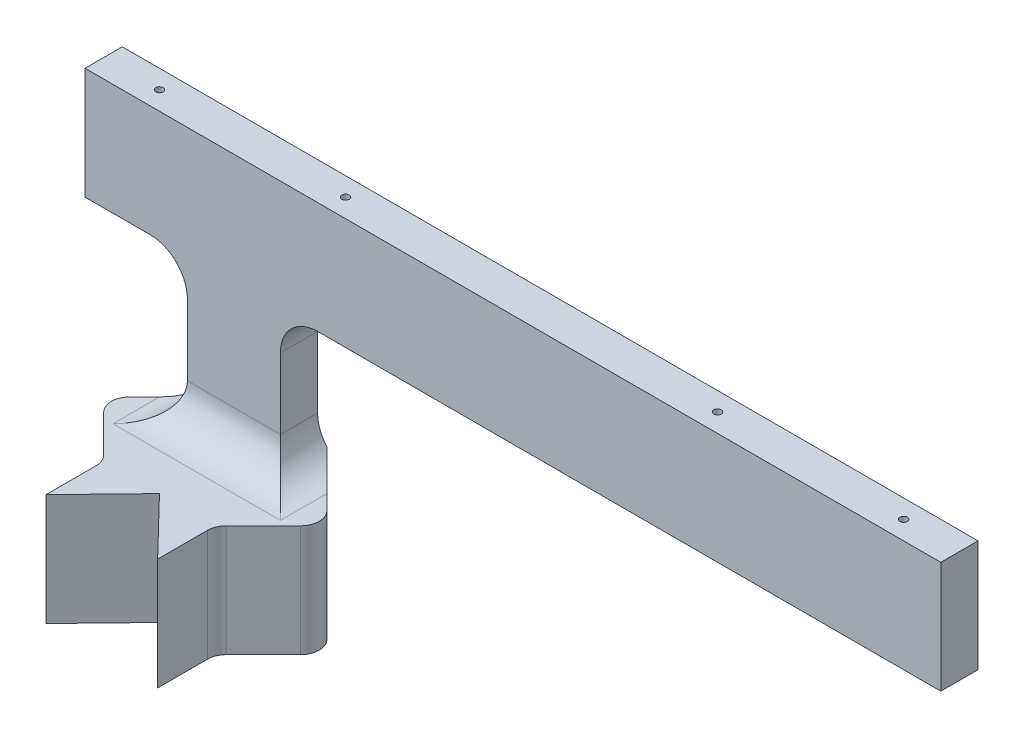
ISO-10303-21;
HEADER;
FILE_DESCRIPTION(('STEP AP214'),'2;1');
FILE_NAME('part.step','',(''),(''),'','','');
FILE_SCHEMA(('AUTOMOTIVE_DESIGN { 1 0 10303 214 1 1 1 1 }'));
ENDSEC;
DATA;
#1=APPLICATION_CONTEXT('core data for automotive mechanical design processes');
#2=APPLICATION_PROTOCOL_DEFINITION('international standard','automotive_design',2000,#1);
#3=PRODUCT_CONTEXT('',#1,'mechanical');
#4=PRODUCT('Part','Part','',(#3));
#5=PRODUCT_RELATED_PRODUCT_CATEGORY('part','',(#4));
#6=PRODUCT_DEFINITION_FORMATION('','',#4);
#7=PRODUCT_DEFINITION_CONTEXT('part definition',#1,'design');
#8=PRODUCT_DEFINITION('design','',#6,#7);
#9=PRODUCT_DEFINITION_SHAPE('','',#8);
#10=(LENGTH_UNIT() NAMED_UNIT(*) SI_UNIT(.MILLI.,.METRE.));
#11=(NAMED_UNIT(*) PLANE_ANGLE_UNIT() SI_UNIT($,.RADIAN.));
#12=(NAMED_UNIT(*) SI_UNIT($,.STERADIAN.) SOLID_ANGLE_UNIT());
#13=UNCERTAINTY_MEASURE_WITH_UNIT(LENGTH_MEASURE(1.E-05),#10,'distance_accuracy_value','');
#14=(GEOMETRIC_REPRESENTATION_CONTEXT(3) GLOBAL_UNCERTAINTY_ASSIGNED_CONTEXT((#13)) GLOBAL_UNIT_ASSIGNED_CONTEXT((#10,
#11,#12)) REPRESENTATION_CONTEXT('',''));
#15=CARTESIAN_POINT('',(0.,0.,0.));
#16=DIRECTION('',(0.,0.,1.));
#17=DIRECTION('',(1.,0.,0.));
#18=AXIS2_PLACEMENT_3D('',#15,#16,#17);
#19=CARTESIAN_POINT('',(0.,-54.,0.));
#20=DIRECTION('',(0.,1.,0.));
#21=DIRECTION('',(-1.,0.,0.));
#22=AXIS2_PLACEMENT_3D('',#19,#20,#21);
#23=PLANE('',#22);
#24=DIRECTION('',(-0.707106845079773,0.,-0.707106717293317));
#25=VECTOR('',#24,1.);
#26=CARTESIAN_POINT('',(-29.9999945784798,-54.,29.9999999999995));
#27=LINE('',#26,#25);
#28=CARTESIAN_POINT('',(-48.5355342253989,-54.,11.4644637027735));
#29=VERTEX_POINT('',#28);
#30=CARTESIAN_POINT('',(-52.5,-54.,7.49999864462005));
#31=VERTEX_POINT('',#30);
#32=EDGE_CURVE('E323',#29,#31,#27,.T.);
#33=ORIENTED_EDGE('',*,*,#32,.T.);
#34=DIRECTION('',(0.,0.,-1.));
#35=VECTOR('',#34,1.);
#36=CARTESIAN_POINT('',(-52.5,-54.,0.));
#37=LINE('',#36,#35);
#38=CARTESIAN_POINT('',(-52.5,-54.,20.));
#39=VERTEX_POINT('',#38);
#40=EDGE_CURVE('E462',#31,#39,#37,.F.);
#41=ORIENTED_EDGE('',*,*,#40,.T.);
#42=DIRECTION('',(1.,0.,0.));
#43=VECTOR('',#42,1.);
#44=CARTESIAN_POINT('',(0.,-54.,20.));
#45=LINE('',#44,#43);
#46=CARTESIAN_POINT('',(-97.5,-54.,20.));
#47=VERTEX_POINT('',#46);
#48=EDGE_CURVE('E458',#39,#47,#45,.F.);
#49=ORIENTED_EDGE('',*,*,#48,.T.);
#50=DIRECTION('',(0.,0.,1.));
#51=VECTOR('',#50,1.);
#52=CARTESIAN_POINT('',(-97.5,-54.,0.));
#53=LINE('',#52,#51);
#54=CARTESIAN_POINT('',(-97.5,-54.,7.49999864462007));
#55=VERTEX_POINT('',#54);
#56=EDGE_CURVE('E460',#47,#55,#53,.F.);
#57=ORIENTED_EDGE('',*,*,#56,.T.);
#58=DIRECTION('',(0.707106845079774,0.,-0.707106717293316));
#59=VECTOR('',#58,1.);
#60=CARTESIAN_POINT('',(-44.9999918677196,-54.,-44.9999999999993));
#61=LINE('',#60,#59);
#62=CARTESIAN_POINT('',(-101.464465774601,-54.,11.4644637027735));
#63=VERTEX_POINT('',#62);
#64=EDGE_CURVE('E312',#63,#55,#61,.T.);
#65=ORIENTED_EDGE('',*,*,#64,.F.);
#66=CARTESIAN_POINT('',(-97.9289321881345,-54.,14.9999979281723));
#67=DIRECTION('',(0.,1.,0.));
#68=DIRECTION('',(-1.,0.,0.));
#69=AXIS2_PLACEMENT_3D('',#66,#67,#68);
#70=CIRCLE('',#69,5.);
#71=CARTESIAN_POINT('',(-101.464466413533,-54.,18.535531514639));
#72=VERTEX_POINT('',#71);
#73=EDGE_CURVE('E436',#63,#72,#70,.T.);
#74=ORIENTED_EDGE('',*,*,#73,.T.);
#75=DIRECTION('',(-0.707106717293327,0.,-0.707106845079762));
#76=VECTOR('',#75,1.);
#77=CARTESIAN_POINT('',(-60.0000081322786,-54.,59.9999972892396));
#78=LINE('',#77,#76);
#79=CARTESIAN_POINT('',(-91.4644657746012,-54.,28.5355339607445));
#80=VERTEX_POINT('',#79);
#81=EDGE_CURVE('E329',#80,#72,#78,.T.);
#82=ORIENTED_EDGE('',*,*,#81,.F.);
#83=CARTESIAN_POINT('',(-95.,-54.,32.0710675472111));
#84=DIRECTION('',(0.,1.,0.));
#85=DIRECTION('',(-1.,0.,0.));
#86=AXIS2_PLACEMENT_3D('',#83,#84,#85);
#87=CIRCLE('',#86,5.);
#88=CARTESIAN_POINT('',(-90.,-54.,32.0710675472111));
#89=VERTEX_POINT('',#88);
#90=EDGE_CURVE('E450',#80,#89,#87,.F.);
#91=ORIENTED_EDGE('',*,*,#90,.T.);
#92=DIRECTION('',(0.,0.,-1.));
#93=VECTOR('',#92,1.);
#94=CARTESIAN_POINT('',(-90.,-54.,0.));
#95=LINE('',#94,#93);
#96=CARTESIAN_POINT('',(-90.,-54.,45.4999972892401));
#97=VERTEX_POINT('',#96);
#98=EDGE_CURVE('E297',#97,#89,#95,.T.);
#99=ORIENTED_EDGE('',*,*,#98,.F.);
#100=DIRECTION('',(0.695421490319644,0.,-0.71860208098892));
#101=VECTOR('',#100,1.);
#102=CARTESIAN_POINT('',(-23.7372314068771,-54.,-22.9715182821565));
#103=LINE('',#102,#101);
#104=CARTESIAN_POINT('',(-75.,-54.,30.));
#105=VERTEX_POINT('',#104);
#106=EDGE_CURVE('E295',#97,#105,#103,.T.);
#107=ORIENTED_EDGE('',*,*,#106,.T.);
#108=DIRECTION('',(0.695421490319644,0.,0.71860208098892));
#109=VECTOR('',#108,1.);
#110=CARTESIAN_POINT('',(-53.7211112133638,-54.,51.9881812340602));
#111=LINE('',#110,#109);
#112=CARTESIAN_POINT('',(-60.,-54.,45.4999972892401));
#113=VERTEX_POINT('',#112);
#114=EDGE_CURVE('E282',#105,#113,#111,.T.);
#115=ORIENTED_EDGE('',*,*,#114,.T.);
#116=DIRECTION('',(0.,0.,-1.));
#117=VECTOR('',#116,1.);
#118=CARTESIAN_POINT('',(-60.,-54.,0.));
#119=LINE('',#118,#117);
#120=CARTESIAN_POINT('',(-60.,-54.,32.0710675472111));
#121=VERTEX_POINT('',#120);
#122=EDGE_CURVE('E278',#113,#121,#119,.T.);
#123=ORIENTED_EDGE('',*,*,#122,.T.);
#124=CARTESIAN_POINT('',(-55.,-54.,32.0710675472111));
#125=DIRECTION('',(0.,1.,0.));
#126=DIRECTION('',(-1.,0.,0.));
#127=AXIS2_PLACEMENT_3D('',#124,#125,#126);
#128=CIRCLE('',#127,5.);
#129=CARTESIAN_POINT('',(-58.5355342253988,-54.,28.5355339607445));
#130=VERTEX_POINT('',#129);
#131=EDGE_CURVE('E453',#121,#130,#128,.F.);
#132=ORIENTED_EDGE('',*,*,#131,.T.);
#133=DIRECTION('',(0.707106717293327,0.,-0.707106845079763));
#134=VECTOR('',#133,1.);
#135=CARTESIAN_POINT('',(-15.0000054215195,-54.,-15.0000027107592));
#136=LINE('',#135,#134);
#137=CARTESIAN_POINT('',(-48.5355335864667,-54.,18.535531514639));
#138=VERTEX_POINT('',#137);
#139=EDGE_CURVE('E316',#130,#138,#136,.T.);
#140=ORIENTED_EDGE('',*,*,#139,.T.);
#141=CARTESIAN_POINT('',(-52.0710678118655,-54.,14.9999979281724));
#142=DIRECTION('',(0.,1.,0.));
#143=DIRECTION('',(-1.,0.,0.));
#144=AXIS2_PLACEMENT_3D('',#141,#142,#143);
#145=CIRCLE('',#144,5.);
#146=EDGE_CURVE('E434',#138,#29,#145,.T.);
#147=ORIENTED_EDGE('',*,*,#146,.T.);
#148=EDGE_LOOP('',(#33,#41,#49,#57,#65,#74,#82,#91,#99,#107,#115,#123,#132,#140,#147));
#149=FACE_BOUND('',#148,.T.);
#150=ADVANCED_FACE('F93',(#149),#23,.T.);
#151=CARTESIAN_POINT('',(0.,-84.,0.));
#152=DIRECTION('',(0.,1.,0.));
#153=DIRECTION('',(-1.,0.,0.));
#154=AXIS2_PLACEMENT_3D('',#151,#152,#153);
#155=PLANE('',#154);
#156=DIRECTION('',(0.707106717293327,0.,0.707106845079762));
#157=VECTOR('',#156,1.);
#158=CARTESIAN_POINT('',(-60.0000081322786,-84.,59.9999972892396));
#159=LINE('',#158,#157);
#160=CARTESIAN_POINT('',(-101.464466413533,-84.,18.535531514639));
#161=VERTEX_POINT('',#160);
#162=CARTESIAN_POINT('',(-91.4644657746012,-84.,28.5355339607445));
#163=VERTEX_POINT('',#162);
#164=EDGE_CURVE('E320',#161,#163,#159,.T.);
#165=ORIENTED_EDGE('',*,*,#164,.F.);
#166=CARTESIAN_POINT('',(-97.9289321881345,-84.,14.9999979281723));
#167=DIRECTION('',(0.,1.,0.));
#168=DIRECTION('',(-1.,0.,0.));
#169=AXIS2_PLACEMENT_3D('',#166,#167,#168);
#170=CIRCLE('',#169,5.);
#171=CARTESIAN_POINT('',(-101.464465774601,-84.,11.4644637027735));
#172=VERTEX_POINT('',#171);
#173=EDGE_CURVE('E430',#161,#172,#170,.F.);
#174=ORIENTED_EDGE('',*,*,#173,.T.);
#175=DIRECTION('',(-0.707106845079774,0.,0.707106717293316));
#176=VECTOR('',#175,1.);
#177=CARTESIAN_POINT('',(-44.9999918677196,-84.,-44.9999999999993));
#178=LINE('',#177,#176);
#179=CARTESIAN_POINT('',(-90.,-84.,0.));
#180=VERTEX_POINT('',#179);
#181=EDGE_CURVE('E308',#180,#172,#178,.T.);
#182=ORIENTED_EDGE('',*,*,#181,.F.);
#183=DIRECTION('',(1.,0.,0.));
#184=VECTOR('',#183,1.);
#185=CARTESIAN_POINT('',(-45.,-84.,0.));
#186=LINE('',#185,#184);
#187=CARTESIAN_POINT('',(-60.,-84.,0.));
#188=VERTEX_POINT('',#187);
#189=EDGE_CURVE('E332',#180,#188,#186,.T.);
#190=ORIENTED_EDGE('',*,*,#189,.T.);
#191=DIRECTION('',(0.707106845079773,0.,0.707106717293317));
#192=VECTOR('',#191,1.);
#193=CARTESIAN_POINT('',(-29.9999945784798,-84.,29.9999999999995));
#194=LINE('',#193,#192);
#195=CARTESIAN_POINT('',(-48.5355342253989,-84.,11.4644637027735));
#196=VERTEX_POINT('',#195);
#197=EDGE_CURVE('E319',#188,#196,#194,.T.);
#198=ORIENTED_EDGE('',*,*,#197,.T.);
#199=CARTESIAN_POINT('',(-52.0710678118655,-84.,14.9999979281724));
#200=DIRECTION('',(0.,1.,0.));
#201=DIRECTION('',(-1.,0.,0.));
#202=AXIS2_PLACEMENT_3D('',#199,#200,#201);
#203=CIRCLE('',#202,5.);
#204=CARTESIAN_POINT('',(-48.5355335864667,-84.,18.535531514639));
#205=VERTEX_POINT('',#204);
#206=EDGE_CURVE('E428',#196,#205,#203,.F.);
#207=ORIENTED_EDGE('',*,*,#206,.T.);
#208=DIRECTION('',(-0.707106717293327,0.,0.707106845079763));
#209=VECTOR('',#208,1.);
#210=CARTESIAN_POINT('',(-15.0000054215195,-84.,-15.0000027107592));
#211=LINE('',#210,#209);
#212=CARTESIAN_POINT('',(-58.5355342253988,-84.,28.5355339607445));
#213=VERTEX_POINT('',#212);
#214=EDGE_CURVE('E306',#205,#213,#211,.T.);
#215=ORIENTED_EDGE('',*,*,#214,.T.);
#216=CARTESIAN_POINT('',(-55.,-84.,32.0710675472111));
#217=DIRECTION('',(0.,1.,0.));
#218=DIRECTION('',(-1.,0.,0.));
#219=AXIS2_PLACEMENT_3D('',#216,#217,#218);
#220=CIRCLE('',#219,5.);
#221=CARTESIAN_POINT('',(-60.,-84.,32.0710675472111));
#222=VERTEX_POINT('',#221);
#223=EDGE_CURVE('E270',#213,#222,#220,.T.);
#224=ORIENTED_EDGE('',*,*,#223,.T.);
#225=DIRECTION('',(0.,0.,-1.));
#226=VECTOR('',#225,1.);
#227=CARTESIAN_POINT('',(-60.,-84.,0.));
#228=LINE('',#227,#226);
#229=CARTESIAN_POINT('',(-60.,-84.,45.4999972892401));
#230=VERTEX_POINT('',#229);
#231=EDGE_CURVE('E262',#230,#222,#228,.T.);
#232=ORIENTED_EDGE('',*,*,#231,.F.);
#233=DIRECTION('',(0.695421490319644,0.,0.71860208098892));
#234=VECTOR('',#233,1.);
#235=CARTESIAN_POINT('',(-53.7211112133638,-84.,51.9881812340602));
#236=LINE('',#235,#234);
#237=CARTESIAN_POINT('',(-75.,-84.,30.));
#238=VERTEX_POINT('',#237);
#239=EDGE_CURVE('E268',#238,#230,#236,.T.);
#240=ORIENTED_EDGE('',*,*,#239,.F.);
#241=DIRECTION('',(0.695421490319644,0.,-0.71860208098892));
#242=VECTOR('',#241,1.);
#243=CARTESIAN_POINT('',(-23.7372314068771,-84.,-22.9715182821565));
#244=LINE('',#243,#242);
#245=CARTESIAN_POINT('',(-90.,-84.,45.4999972892401));
#246=VERTEX_POINT('',#245);
#247=EDGE_CURVE('E293',#246,#238,#244,.T.);
#248=ORIENTED_EDGE('',*,*,#247,.F.);
#249=DIRECTION('',(0.,0.,-1.));
#250=VECTOR('',#249,1.);
#251=CARTESIAN_POINT('',(-90.,-84.,0.));
#252=LINE('',#251,#250);
#253=CARTESIAN_POINT('',(-90.,-84.,32.0710675472111));
#254=VERTEX_POINT('',#253);
#255=EDGE_CURVE('E298',#246,#254,#252,.T.);
#256=ORIENTED_EDGE('',*,*,#255,.T.);
#257=CARTESIAN_POINT('',(-95.,-84.,32.0710675472111));
#258=DIRECTION('',(0.,1.,0.));
#259=DIRECTION('',(-1.,0.,0.));
#260=AXIS2_PLACEMENT_3D('',#257,#258,#259);
#261=CIRCLE('',#260,5.);
#262=EDGE_CURVE('E448',#254,#163,#261,.T.);
#263=ORIENTED_EDGE('',*,*,#262,.T.);
#264=EDGE_LOOP('',(#165,#174,#182,#190,#198,#207,#215,#224,#232,#240,#248,#256,#263));
#265=FACE_BOUND('',#264,.T.);
#266=ADVANCED_FACE('F265',(#265),#155,.F.);
#267=CARTESIAN_POINT('',(0.,0.,0.));
#268=DIRECTION('',(0.,0.,-1.));
#269=DIRECTION('',(-1.,0.,0.));
#270=AXIS2_PLACEMENT_3D('',#267,#268,#269);
#271=PLANE('',#270);
#272=DIRECTION('',(0.,-1.,0.));
#273=VECTOR('',#272,1.);
#274=CARTESIAN_POINT('',(-90.,-44.,0.));
#275=LINE('',#274,#273);
#276=CARTESIAN_POINT('',(-90.,-50.6143782776615,0.));
#277=VERTEX_POINT('',#276);
#278=EDGE_CURVE('E109',#277,#180,#275,.T.);
#279=ORIENTED_EDGE('',*,*,#278,.F.);
#280=CARTESIAN_POINT('',(-97.5,-44.,0.));
#281=DIRECTION('',(0.,0.,-1.));
#282=DIRECTION('',(-1.,0.,0.));
#283=AXIS2_PLACEMENT_3D('',#280,#281,#282);
#284=CIRCLE('',#283,10.);
#285=CARTESIAN_POINT('',(-87.5,-44.,0.));
#286=VERTEX_POINT('',#285);
#287=EDGE_CURVE('E12',#277,#286,#284,.F.);
#288=ORIENTED_EDGE('',*,*,#287,.T.);
#289=DIRECTION('',(0.,1.,0.));
#290=VECTOR('',#289,1.);
#291=CARTESIAN_POINT('',(-87.5,-69.,0.));
#292=LINE('',#291,#290);
#293=CARTESIAN_POINT('',(-87.5,-25.,0.));
#294=VERTEX_POINT('',#293);
#295=EDGE_CURVE('E340',#286,#294,#292,.T.);
#296=ORIENTED_EDGE('',*,*,#295,.T.);
#297=CARTESIAN_POINT('',(-97.5,-25.,0.));
#298=DIRECTION('',(0.,0.,-1.));
#299=DIRECTION('',(-1.,0.,0.));
#300=AXIS2_PLACEMENT_3D('',#297,#298,#299);
#301=CIRCLE('',#300,10.);
#302=CARTESIAN_POINT('',(-97.5,-15.,0.));
#303=VERTEX_POINT('',#302);
#304=EDGE_CURVE('E415',#294,#303,#301,.F.);
#305=ORIENTED_EDGE('',*,*,#304,.T.);
#306=DIRECTION('',(1.,0.,0.));
#307=VECTOR('',#306,1.);
#308=CARTESIAN_POINT('',(115.,-15.,0.));
#309=LINE('',#308,#307);
#310=CARTESIAN_POINT('',(-115.,-15.,0.));
#311=VERTEX_POINT('',#310);
#312=EDGE_CURVE('E383',#311,#303,#309,.T.);
#313=ORIENTED_EDGE('',*,*,#312,.F.);
#314=DIRECTION('',(0.,-1.,0.));
#315=VECTOR('',#314,1.);
#316=CARTESIAN_POINT('',(-115.,15.,0.));
#317=LINE('',#316,#315);
#318=CARTESIAN_POINT('',(-115.,15.,0.));
#319=VERTEX_POINT('',#318);
#320=EDGE_CURVE('E366',#319,#311,#317,.T.);
#321=ORIENTED_EDGE('',*,*,#320,.F.);
#322=DIRECTION('',(-1.,0.,0.));
#323=VECTOR('',#322,1.);
#324=CARTESIAN_POINT('',(115.,15.,0.));
#325=LINE('',#324,#323);
#326=CARTESIAN_POINT('',(115.,15.,0.));
#327=VERTEX_POINT('',#326);
#328=EDGE_CURVE('E371',#327,#319,#325,.T.);
#329=ORIENTED_EDGE('',*,*,#328,.F.);
#330=DIRECTION('',(0.,1.,0.));
#331=VECTOR('',#330,1.);
#332=CARTESIAN_POINT('',(115.,15.,0.));
#333=LINE('',#332,#331);
#334=CARTESIAN_POINT('',(115.,-15.,0.));
#335=VERTEX_POINT('',#334);
#336=EDGE_CURVE('E386',#335,#327,#333,.T.);
#337=ORIENTED_EDGE('',*,*,#336,.F.);
#338=CARTESIAN_POINT('',(-52.5,-15.,0.));
#339=VERTEX_POINT('',#338);
#340=EDGE_CURVE('E382',#339,#335,#309,.T.);
#341=ORIENTED_EDGE('',*,*,#340,.F.);
#342=CARTESIAN_POINT('',(-52.5,-25.,0.));
#343=DIRECTION('',(0.,0.,-1.));
#344=DIRECTION('',(-1.,0.,0.));
#345=AXIS2_PLACEMENT_3D('',#342,#343,#344);
#346=CIRCLE('',#345,10.);
#347=CARTESIAN_POINT('',(-62.5,-25.,0.));
#348=VERTEX_POINT('',#347);
#349=EDGE_CURVE('E412',#339,#348,#346,.F.);
#350=ORIENTED_EDGE('',*,*,#349,.T.);
#351=DIRECTION('',(0.,1.,0.));
#352=VECTOR('',#351,1.);
#353=CARTESIAN_POINT('',(-62.5,-69.,0.));
#354=LINE('',#353,#352);
#355=CARTESIAN_POINT('',(-62.5,-44.,0.));
#356=VERTEX_POINT('',#355);
#357=EDGE_CURVE('E338',#356,#348,#354,.T.);
#358=ORIENTED_EDGE('',*,*,#357,.F.);
#359=CARTESIAN_POINT('',(-52.5,-44.,0.));
#360=DIRECTION('',(0.,0.,-1.));
#361=DIRECTION('',(-1.,0.,0.));
#362=AXIS2_PLACEMENT_3D('',#359,#360,#361);
#363=CIRCLE('',#362,10.);
#364=CARTESIAN_POINT('',(-60.,-50.6143782776615,0.));
#365=VERTEX_POINT('',#364);
#366=EDGE_CURVE('E468',#356,#365,#363,.F.);
#367=ORIENTED_EDGE('',*,*,#366,.T.);
#368=DIRECTION('',(0.,-1.,0.));
#369=VECTOR('',#368,1.);
#370=CARTESIAN_POINT('',(-60.,-44.,0.));
#371=LINE('',#370,#369);
#372=EDGE_CURVE('E117',#365,#188,#371,.T.);
#373=ORIENTED_EDGE('',*,*,#372,.T.);
#374=ORIENTED_EDGE('',*,*,#189,.F.);
#375=EDGE_LOOP('',(#279,#288,#296,#305,#313,#321,#329,#337,#341,#350,#358,#367,#373,#374));
#376=FACE_BOUND('',#375,.T.);
#377=ADVANCED_FACE('F530',(#376),#271,.T.);
#378=CARTESIAN_POINT('',(115.,-15.,10.));
#379=DIRECTION('',(0.,1.,0.));
#380=DIRECTION('',(-1.,0.,0.));
#381=AXIS2_PLACEMENT_3D('',#378,#379,#380);
#382=PLANE('',#381);
#383=CARTESIAN_POINT('',(-100.,-15.,5.));
#384=DIRECTION('',(0.,1.,0.));
#385=DIRECTION('',(-1.,0.,0.));
#386=AXIS2_PLACEMENT_3D('',#383,#384,#385);
#387=CIRCLE('',#386,0.999999999999998);
#388=CARTESIAN_POINT('',(-101.,-15.,5.));
#389=VERTEX_POINT('',#388);
#390=EDGE_CURVE('E360',#389,#389,#387,.T.);
#391=ORIENTED_EDGE('',*,*,#390,.T.);
#392=EDGE_LOOP('',(#391));
#393=FACE_BOUND('',#392,.T.);
#394=ORIENTED_EDGE('',*,*,#312,.T.);
#395=DIRECTION('',(0.,0.,-1.));
#396=VECTOR('',#395,1.);
#397=CARTESIAN_POINT('',(-97.5,-15.,10.));
#398=LINE('',#397,#396);
#399=CARTESIAN_POINT('',(-97.5,-15.,10.));
#400=VERTEX_POINT('',#399);
#401=EDGE_CURVE('E408',#303,#400,#398,.F.);
#402=ORIENTED_EDGE('',*,*,#401,.T.);
#403=DIRECTION('',(1.,0.,0.));
#404=VECTOR('',#403,1.);
#405=CARTESIAN_POINT('',(115.,-15.,10.));
#406=LINE('',#405,#404);
#407=CARTESIAN_POINT('',(-115.,-15.,10.));
#408=VERTEX_POINT('',#407);
#409=EDGE_CURVE('E372',#408,#400,#406,.T.);
#410=ORIENTED_EDGE('',*,*,#409,.F.);
#411=DIRECTION('',(0.,0.,-1.));
#412=VECTOR('',#411,1.);
#413=CARTESIAN_POINT('',(-115.,-15.,10.));
#414=LINE('',#413,#412);
#415=EDGE_CURVE('E397',#408,#311,#414,.T.);
#416=ORIENTED_EDGE('',*,*,#415,.T.);
#417=EDGE_LOOP('',(#394,#402,#410,#416));
#418=FACE_BOUND('',#417,.T.);
#419=ADVANCED_FACE('F568',(#393,#418),#382,.F.);
#420=CARTESIAN_POINT('',(50.,-15.,5.00000000000001));
#421=DIRECTION('',(0.,1.,0.));
#422=DIRECTION('',(-1.,0.,0.));
#423=AXIS2_PLACEMENT_3D('',#420,#421,#422);
#424=CIRCLE('',#423,0.999999999999998);
#425=CARTESIAN_POINT('',(49.,-15.,5.00000000000001));
#426=VERTEX_POINT('',#425);
#427=EDGE_CURVE('E354',#426,#426,#424,.T.);
#428=ORIENTED_EDGE('',*,*,#427,.T.);
#429=EDGE_LOOP('',(#428));
#430=FACE_BOUND('',#429,.T.);
#431=CARTESIAN_POINT('',(-50.,-15.,5.00000000000001));
#432=DIRECTION('',(0.,1.,0.));
#433=DIRECTION('',(-1.,0.,0.));
#434=AXIS2_PLACEMENT_3D('',#431,#432,#433);
#435=CIRCLE('',#434,0.999999999999998);
#436=CARTESIAN_POINT('',(-51.,-15.,5.00000000000001));
#437=VERTEX_POINT('',#436);
#438=EDGE_CURVE('E357',#437,#437,#435,.T.);
#439=ORIENTED_EDGE('',*,*,#438,.T.);
#440=EDGE_LOOP('',(#439));
#441=FACE_BOUND('',#440,.T.);
#442=CARTESIAN_POINT('',(100.,-15.,5.));
#443=DIRECTION('',(0.,1.,0.));
#444=DIRECTION('',(-1.,0.,0.));
#445=AXIS2_PLACEMENT_3D('',#442,#443,#444);
#446=CIRCLE('',#445,0.999999999999998);
#447=CARTESIAN_POINT('',(99.,-15.,5.));
#448=VERTEX_POINT('',#447);
#449=EDGE_CURVE('E363',#448,#448,#446,.T.);
#450=ORIENTED_EDGE('',*,*,#449,.T.);
#451=EDGE_LOOP('',(#450));
#452=FACE_BOUND('',#451,.T.);
#453=CARTESIAN_POINT('',(-52.5,-15.,10.));
#454=VERTEX_POINT('',#453);
#455=CARTESIAN_POINT('',(115.,-15.,10.));
#456=VERTEX_POINT('',#455);
#457=EDGE_CURVE('E370',#454,#456,#406,.T.);
#458=ORIENTED_EDGE('',*,*,#457,.F.);
#459=DIRECTION('',(0.,0.,1.));
#460=VECTOR('',#459,1.);
#461=CARTESIAN_POINT('',(-52.5,-15.,0.));
#462=LINE('',#461,#460);
#463=EDGE_CURVE('E403',#454,#339,#462,.F.);
#464=ORIENTED_EDGE('',*,*,#463,.T.);
#465=ORIENTED_EDGE('',*,*,#340,.T.);
#466=DIRECTION('',(0.,0.,-1.));
#467=VECTOR('',#466,1.);
#468=CARTESIAN_POINT('',(115.,-15.,10.));
#469=LINE('',#468,#467);
#470=EDGE_CURVE('E394',#456,#335,#469,.T.);
#471=ORIENTED_EDGE('',*,*,#470,.F.);
#472=EDGE_LOOP('',(#458,#464,#465,#471));
#473=FACE_BOUND('',#472,.T.);
#474=ADVANCED_FACE('F579',(#430,#441,#452,#473),#382,.F.);
#475=CARTESIAN_POINT('',(-115.,15.,10.));
#476=DIRECTION('',(1.,0.,0.));
#477=DIRECTION('',(0.,0.,-1.));
#478=AXIS2_PLACEMENT_3D('',#475,#476,#477);
#479=PLANE('',#478);
#480=ORIENTED_EDGE('',*,*,#320,.T.);
#481=ORIENTED_EDGE('',*,*,#415,.F.);
#482=DIRECTION('',(0.,-1.,0.));
#483=VECTOR('',#482,1.);
#484=CARTESIAN_POINT('',(-115.,15.,10.));
#485=LINE('',#484,#483);
#486=CARTESIAN_POINT('',(-115.,15.,10.));
#487=VERTEX_POINT('',#486);
#488=EDGE_CURVE('E367',#487,#408,#485,.T.);
#489=ORIENTED_EDGE('',*,*,#488,.F.);
#490=DIRECTION('',(0.,0.,-1.));
#491=VECTOR('',#490,1.);
#492=CARTESIAN_POINT('',(-115.,15.,10.));
#493=LINE('',#492,#491);
#494=EDGE_CURVE('E379',#487,#319,#493,.T.);
#495=ORIENTED_EDGE('',*,*,#494,.T.);
#496=EDGE_LOOP('',(#480,#481,#489,#495));
#497=FACE_BOUND('',#496,.T.);
#498=ADVANCED_FACE('F575',(#497),#479,.F.);
#499=CARTESIAN_POINT('',(115.,15.,10.));
#500=DIRECTION('',(-1.,0.,0.));
#501=DIRECTION('',(0.,0.,1.));
#502=AXIS2_PLACEMENT_3D('',#499,#500,#501);
#503=PLANE('',#502);
#504=ORIENTED_EDGE('',*,*,#336,.T.);
#505=DIRECTION('',(0.,0.,-1.));
#506=VECTOR('',#505,1.);
#507=CARTESIAN_POINT('',(115.,15.,10.));
#508=LINE('',#507,#506);
#509=CARTESIAN_POINT('',(115.,15.,10.));
#510=VERTEX_POINT('',#509);
#511=EDGE_CURVE('E391',#510,#327,#508,.T.);
#512=ORIENTED_EDGE('',*,*,#511,.F.);
#513=DIRECTION('',(0.,1.,0.));
#514=VECTOR('',#513,1.);
#515=CARTESIAN_POINT('',(115.,15.,10.));
#516=LINE('',#515,#514);
#517=EDGE_CURVE('E375',#456,#510,#516,.T.);
#518=ORIENTED_EDGE('',*,*,#517,.F.);
#519=ORIENTED_EDGE('',*,*,#470,.T.);
#520=EDGE_LOOP('',(#504,#512,#518,#519));
#521=FACE_BOUND('',#520,.T.);
#522=ADVANCED_FACE('F571',(#521),#503,.F.);
#523=CARTESIAN_POINT('',(115.,15.,10.));
#524=DIRECTION('',(0.,-1.,0.));
#525=DIRECTION('',(1.,0.,0.));
#526=AXIS2_PLACEMENT_3D('',#523,#524,#525);
#527=PLANE('',#526);
#528=CARTESIAN_POINT('',(100.,15.,5.));
#529=DIRECTION('',(0.,1.,0.));
#530=DIRECTION('',(-1.,0.,0.));
#531=AXIS2_PLACEMENT_3D('',#528,#529,#530);
#532=CIRCLE('',#531,0.999999999999998);
#533=CARTESIAN_POINT('',(99.,15.,5.));
#534=VERTEX_POINT('',#533);
#535=EDGE_CURVE('E346',#534,#534,#532,.T.);
#536=ORIENTED_EDGE('',*,*,#535,.F.);
#537=EDGE_LOOP('',(#536));
#538=FACE_BOUND('',#537,.T.);
#539=CARTESIAN_POINT('',(-100.,15.,5.));
#540=DIRECTION('',(0.,1.,0.));
#541=DIRECTION('',(1.,0.,0.));
#542=AXIS2_PLACEMENT_3D('',#539,#540,#541);
#543=CIRCLE('',#542,0.999999999999998);
#544=CARTESIAN_POINT('',(-99.,15.,5.));
#545=VERTEX_POINT('',#544);
#546=EDGE_CURVE('E345',#545,#545,#543,.T.);
#547=ORIENTED_EDGE('',*,*,#546,.F.);
#548=EDGE_LOOP('',(#547));
#549=FACE_BOUND('',#548,.T.);
#550=CARTESIAN_POINT('',(-50.,15.,5.00000000000001));
#551=DIRECTION('',(0.,1.,0.));
#552=DIRECTION('',(1.,0.,0.));
#553=AXIS2_PLACEMENT_3D('',#550,#551,#552);
#554=CIRCLE('',#553,0.999999999999998);
#555=CARTESIAN_POINT('',(-49.,15.,5.00000000000001));
#556=VERTEX_POINT('',#555);
#557=EDGE_CURVE('E342',#556,#556,#554,.T.);
#558=ORIENTED_EDGE('',*,*,#557,.F.);
#559=EDGE_LOOP('',(#558));
#560=FACE_BOUND('',#559,.T.);
#561=CARTESIAN_POINT('',(50.,15.,5.00000000000001));
#562=DIRECTION('',(0.,1.,0.));
#563=DIRECTION('',(-1.,0.,0.));
#564=AXIS2_PLACEMENT_3D('',#561,#562,#563);
#565=CIRCLE('',#564,0.999999999999998);
#566=CARTESIAN_POINT('',(49.,15.,5.00000000000001));
#567=VERTEX_POINT('',#566);
#568=EDGE_CURVE('E349',#567,#567,#565,.T.);
#569=ORIENTED_EDGE('',*,*,#568,.F.);
#570=EDGE_LOOP('',(#569));
#571=FACE_BOUND('',#570,.T.);
#572=ORIENTED_EDGE('',*,*,#328,.T.);
#573=ORIENTED_EDGE('',*,*,#494,.F.);
#574=DIRECTION('',(-1.,0.,0.));
#575=VECTOR('',#574,1.);
#576=CARTESIAN_POINT('',(115.,15.,10.));
#577=LINE('',#576,#575);
#578=EDGE_CURVE('E377',#510,#487,#577,.T.);
#579=ORIENTED_EDGE('',*,*,#578,.F.);
#580=ORIENTED_EDGE('',*,*,#511,.T.);
#581=EDGE_LOOP('',(#572,#573,#579,#580));
#582=FACE_BOUND('',#581,.T.);
#583=ADVANCED_FACE('F564',(#538,#549,#560,#571,#582),#527,.F.);
#584=CARTESIAN_POINT('',(0.,0.,10.));
#585=DIRECTION('',(0.,0.,-1.));
#586=DIRECTION('',(-1.,0.,0.));
#587=AXIS2_PLACEMENT_3D('',#584,#585,#586);
#588=PLANE('',#587);
#589=DIRECTION('',(0.,1.,0.));
#590=VECTOR('',#589,1.);
#591=CARTESIAN_POINT('',(-87.5,-69.,10.));
#592=LINE('',#591,#590);
#593=CARTESIAN_POINT('',(-87.5,-44.,10.));
#594=VERTEX_POINT('',#593);
#595=CARTESIAN_POINT('',(-87.5,-25.,10.));
#596=VERTEX_POINT('',#595);
#597=EDGE_CURVE('E334',#594,#596,#592,.T.);
#598=ORIENTED_EDGE('',*,*,#597,.F.);
#599=DIRECTION('',(1.,0.,0.));
#600=VECTOR('',#599,1.);
#601=CARTESIAN_POINT('',(0.,-44.,10.));
#602=LINE('',#601,#600);
#603=CARTESIAN_POINT('',(-62.5,-44.,10.));
#604=VERTEX_POINT('',#603);
#605=EDGE_CURVE('E466',#594,#604,#602,.T.);
#606=ORIENTED_EDGE('',*,*,#605,.T.);
#607=DIRECTION('',(0.,1.,0.));
#608=VECTOR('',#607,1.);
#609=CARTESIAN_POINT('',(-62.5,-69.,10.));
#610=LINE('',#609,#608);
#611=CARTESIAN_POINT('',(-62.5,-25.,10.));
#612=VERTEX_POINT('',#611);
#613=EDGE_CURVE('E336',#604,#612,#610,.T.);
#614=ORIENTED_EDGE('',*,*,#613,.T.);
#615=CARTESIAN_POINT('',(-52.5,-25.,10.));
#616=DIRECTION('',(0.,0.,-1.));
#617=DIRECTION('',(-1.,0.,0.));
#618=AXIS2_PLACEMENT_3D('',#615,#616,#617);
#619=CIRCLE('',#618,10.);
#620=EDGE_CURVE('E410',#612,#454,#619,.T.);
#621=ORIENTED_EDGE('',*,*,#620,.T.);
#622=ORIENTED_EDGE('',*,*,#457,.T.);
#623=ORIENTED_EDGE('',*,*,#517,.T.);
#624=ORIENTED_EDGE('',*,*,#578,.T.);
#625=ORIENTED_EDGE('',*,*,#488,.T.);
#626=ORIENTED_EDGE('',*,*,#409,.T.);
#627=CARTESIAN_POINT('',(-97.5,-25.,10.));
#628=DIRECTION('',(0.,0.,-1.));
#629=DIRECTION('',(-1.,0.,0.));
#630=AXIS2_PLACEMENT_3D('',#627,#628,#629);
#631=CIRCLE('',#630,10.);
#632=EDGE_CURVE('E417',#400,#596,#631,.T.);
#633=ORIENTED_EDGE('',*,*,#632,.T.);
#634=EDGE_LOOP('',(#598,#606,#614,#621,#622,#623,#624,#625,#626,#633));
#635=FACE_BOUND('',#634,.T.);
#636=ADVANCED_FACE('F560',(#635),#588,.F.);
#637=CARTESIAN_POINT('',(50.,-39.,5.00000000000001));
#638=DIRECTION('',(0.,1.,0.));
#639=DIRECTION('',(-1.,0.,0.));
#640=AXIS2_PLACEMENT_3D('',#637,#638,#639);
#641=CYLINDRICAL_SURFACE('',#640,0.999999999999998);
#642=ORIENTED_EDGE('',*,*,#568,.T.);
#643=EDGE_LOOP('',(#642));
#644=FACE_BOUND('',#643,.T.);
#645=ORIENTED_EDGE('',*,*,#427,.F.);
#646=EDGE_LOOP('',(#645));
#647=FACE_BOUND('',#646,.T.);
#648=ADVANCED_FACE('F550',(#644,#647),#641,.F.);
#649=CARTESIAN_POINT('',(-50.,-39.,5.00000000000001));
#650=DIRECTION('',(0.,1.,0.));
#651=DIRECTION('',(-1.,0.,0.));
#652=AXIS2_PLACEMENT_3D('',#649,#650,#651);
#653=CYLINDRICAL_SURFACE('',#652,0.999999999999998);
#654=ORIENTED_EDGE('',*,*,#557,.T.);
#655=EDGE_LOOP('',(#654));
#656=FACE_BOUND('',#655,.T.);
#657=ORIENTED_EDGE('',*,*,#438,.F.);
#658=EDGE_LOOP('',(#657));
#659=FACE_BOUND('',#658,.T.);
#660=ADVANCED_FACE('F546',(#656,#659),#653,.F.);
#661=CARTESIAN_POINT('',(-100.,-39.,5.));
#662=DIRECTION('',(0.,1.,0.));
#663=DIRECTION('',(-1.,0.,0.));
#664=AXIS2_PLACEMENT_3D('',#661,#662,#663);
#665=CYLINDRICAL_SURFACE('',#664,0.999999999999998);
#666=ORIENTED_EDGE('',*,*,#546,.T.);
#667=EDGE_LOOP('',(#666));
#668=FACE_BOUND('',#667,.T.);
#669=ORIENTED_EDGE('',*,*,#390,.F.);
#670=EDGE_LOOP('',(#669));
#671=FACE_BOUND('',#670,.T.);
#672=ADVANCED_FACE('F549',(#668,#671),#665,.F.);
#673=CARTESIAN_POINT('',(100.,-39.,5.));
#674=DIRECTION('',(0.,1.,0.));
#675=DIRECTION('',(-1.,0.,0.));
#676=AXIS2_PLACEMENT_3D('',#673,#674,#675);
#677=CYLINDRICAL_SURFACE('',#676,0.999999999999998);
#678=ORIENTED_EDGE('',*,*,#535,.T.);
#679=EDGE_LOOP('',(#678));
#680=FACE_BOUND('',#679,.T.);
#681=ORIENTED_EDGE('',*,*,#449,.F.);
#682=EDGE_LOOP('',(#681));
#683=FACE_BOUND('',#682,.T.);
#684=ADVANCED_FACE('F544',(#680,#683),#677,.F.);
#685=CARTESIAN_POINT('',(-87.5,-69.,10.));
#686=DIRECTION('',(1.,0.,0.));
#687=DIRECTION('',(0.,1.,0.));
#688=AXIS2_PLACEMENT_3D('',#685,#686,#687);
#689=PLANE('',#688);
#690=ORIENTED_EDGE('',*,*,#295,.F.);
#691=DIRECTION('',(0.,0.,1.));
#692=VECTOR('',#691,1.);
#693=CARTESIAN_POINT('',(-87.5,-44.,10.));
#694=LINE('',#693,#692);
#695=EDGE_CURVE('E464',#286,#594,#694,.T.);
#696=ORIENTED_EDGE('',*,*,#695,.T.);
#697=ORIENTED_EDGE('',*,*,#597,.T.);
#698=DIRECTION('',(0.,0.,-1.));
#699=VECTOR('',#698,1.);
#700=CARTESIAN_POINT('',(-87.5,-25.,0.));
#701=LINE('',#700,#699);
#702=EDGE_CURVE('E405',#596,#294,#701,.T.);
#703=ORIENTED_EDGE('',*,*,#702,.T.);
#704=EDGE_LOOP('',(#690,#696,#697,#703));
#705=FACE_BOUND('',#704,.T.);
#706=ADVANCED_FACE('F540',(#705),#689,.F.);
#707=CARTESIAN_POINT('',(-62.5,-69.,10.));
#708=DIRECTION('',(-1.,0.,0.));
#709=DIRECTION('',(0.,-1.,0.));
#710=AXIS2_PLACEMENT_3D('',#707,#708,#709);
#711=PLANE('',#710);
#712=ORIENTED_EDGE('',*,*,#613,.F.);
#713=DIRECTION('',(0.,0.,-1.));
#714=VECTOR('',#713,1.);
#715=CARTESIAN_POINT('',(-62.5,-44.,10.));
#716=LINE('',#715,#714);
#717=EDGE_CURVE('E455',#604,#356,#716,.T.);
#718=ORIENTED_EDGE('',*,*,#717,.T.);
#719=ORIENTED_EDGE('',*,*,#357,.T.);
#720=DIRECTION('',(0.,0.,1.));
#721=VECTOR('',#720,1.);
#722=CARTESIAN_POINT('',(-62.5,-25.,10.));
#723=LINE('',#722,#721);
#724=EDGE_CURVE('E400',#348,#612,#723,.T.);
#725=ORIENTED_EDGE('',*,*,#724,.T.);
#726=EDGE_LOOP('',(#712,#718,#719,#725));
#727=FACE_BOUND('',#726,.T.);
#728=ADVANCED_FACE('F536',(#727),#711,.F.);
#729=CARTESIAN_POINT('',(-52.5,-25.,10.));
#730=DIRECTION('',(0.,0.,-1.));
#731=DIRECTION('',(-1.,0.,0.));
#732=AXIS2_PLACEMENT_3D('',#729,#730,#731);
#733=CYLINDRICAL_SURFACE('',#732,10.);
#734=ORIENTED_EDGE('',*,*,#349,.F.);
#735=ORIENTED_EDGE('',*,*,#463,.F.);
#736=ORIENTED_EDGE('',*,*,#620,.F.);
#737=ORIENTED_EDGE('',*,*,#724,.F.);
#738=EDGE_LOOP('',(#734,#735,#736,#737));
#739=FACE_BOUND('',#738,.T.);
#740=ADVANCED_FACE('F539',(#739),#733,.F.);
#741=CARTESIAN_POINT('',(-97.5,-25.,10.));
#742=DIRECTION('',(0.,0.,1.));
#743=DIRECTION('',(1.,0.,0.));
#744=AXIS2_PLACEMENT_3D('',#741,#742,#743);
#745=CYLINDRICAL_SURFACE('',#744,10.);
#746=ORIENTED_EDGE('',*,*,#632,.F.);
#747=ORIENTED_EDGE('',*,*,#401,.F.);
#748=ORIENTED_EDGE('',*,*,#304,.F.);
#749=ORIENTED_EDGE('',*,*,#702,.F.);
#750=EDGE_LOOP('',(#746,#747,#748,#749));
#751=FACE_BOUND('',#750,.T.);
#752=ADVANCED_FACE('F586',(#751),#745,.F.);
#753=CARTESIAN_POINT('',(-29.9999945784798,-44.,29.9999999999995));
#754=DIRECTION('',(0.707106717293317,0.,-0.707106845079773));
#755=DIRECTION('',(-0.707106845079773,0.,-0.707106717293317));
#756=AXIS2_PLACEMENT_3D('',#753,#754,#755);
#757=PLANE('',#756);
#758=ORIENTED_EDGE('',*,*,#32,.F.);
#759=DIRECTION('',(0.,-1.,0.));
#760=VECTOR('',#759,1.);
#761=CARTESIAN_POINT('',(-48.5355342253989,-44.,11.4644637027735));
#762=LINE('',#761,#760);
#763=EDGE_CURVE('E438',#29,#196,#762,.T.);
#764=ORIENTED_EDGE('',*,*,#763,.T.);
#765=ORIENTED_EDGE('',*,*,#197,.F.);
#766=ORIENTED_EDGE('',*,*,#372,.F.);
#767=CARTESIAN_POINT('',(-52.5,-44.,7.49999864462006));
#768=DIRECTION('',(0.707106717293317,0.,-0.707106845079773));
#769=DIRECTION('',(-0.707106845079773,0.,-0.707106717293317));
#770=AXIS2_PLACEMENT_3D('',#767,#768,#769);
#771=ELLIPSE('',#770,14.1421343458666,10.);
#772=EDGE_CURVE('E470',#365,#31,#771,.F.);
#773=ORIENTED_EDGE('',*,*,#772,.T.);
#774=EDGE_LOOP('',(#758,#764,#765,#766,#773));
#775=FACE_BOUND('',#774,.T.);
#776=ADVANCED_FACE('F533',(#775),#757,.T.);
#777=CARTESIAN_POINT('',(-60.0000081322786,-44.,59.9999972892396));
#778=DIRECTION('',(0.707106845079762,0.,-0.707106717293327));
#779=DIRECTION('',(-0.707106717293327,0.,-0.707106845079762));
#780=AXIS2_PLACEMENT_3D('',#777,#778,#779);
#781=PLANE('',#780);
#782=ORIENTED_EDGE('',*,*,#164,.T.);
#783=DIRECTION('',(0.,-1.,0.));
#784=VECTOR('',#783,1.);
#785=CARTESIAN_POINT('',(-91.4644657746012,-44.,28.5355339607445));
#786=LINE('',#785,#784);
#787=EDGE_CURVE('E426',#163,#80,#786,.F.);
#788=ORIENTED_EDGE('',*,*,#787,.T.);
#789=ORIENTED_EDGE('',*,*,#81,.T.);
#790=DIRECTION('',(0.,-1.,0.));
#791=VECTOR('',#790,1.);
#792=CARTESIAN_POINT('',(-101.464466413533,-44.,18.535531514639));
#793=LINE('',#792,#791);
#794=EDGE_CURVE('E423',#72,#161,#793,.T.);
#795=ORIENTED_EDGE('',*,*,#794,.T.);
#796=EDGE_LOOP('',(#782,#788,#789,#795));
#797=FACE_BOUND('',#796,.T.);
#798=ADVANCED_FACE('F501',(#797),#781,.F.);
#799=CARTESIAN_POINT('',(-44.9999918677196,-44.,-44.9999999999993));
#800=DIRECTION('',(0.707106717293316,0.,0.707106845079774));
#801=DIRECTION('',(0.707106845079774,0.,-0.707106717293316));
#802=AXIS2_PLACEMENT_3D('',#799,#800,#801);
#803=PLANE('',#802);
#804=ORIENTED_EDGE('',*,*,#181,.T.);
#805=DIRECTION('',(0.,-1.,0.));
#806=VECTOR('',#805,1.);
#807=CARTESIAN_POINT('',(-101.464465774601,-44.,11.4644637027735));
#808=LINE('',#807,#806);
#809=EDGE_CURVE('E432',#172,#63,#808,.F.);
#810=ORIENTED_EDGE('',*,*,#809,.T.);
#811=ORIENTED_EDGE('',*,*,#64,.T.);
#812=CARTESIAN_POINT('',(-97.5,-44.,7.49999864462006));
#813=DIRECTION('',(0.707106717293316,0.,0.707106845079774));
#814=DIRECTION('',(-0.707106845079774,0.,0.707106717293316));
#815=AXIS2_PLACEMENT_3D('',#812,#813,#814);
#816=ELLIPSE('',#815,14.1421343458665,10.);
#817=EDGE_CURVE('E102',#55,#277,#816,.T.);
#818=ORIENTED_EDGE('',*,*,#817,.T.);
#819=ORIENTED_EDGE('',*,*,#278,.T.);
#820=EDGE_LOOP('',(#804,#810,#811,#818,#819));
#821=FACE_BOUND('',#820,.T.);
#822=ADVANCED_FACE('F492',(#821),#803,.F.);
#823=CARTESIAN_POINT('',(-15.0000054215195,-44.,-15.0000027107592));
#824=DIRECTION('',(0.707106845079763,0.,0.707106717293327));
#825=DIRECTION('',(0.707106717293327,0.,-0.707106845079763));
#826=AXIS2_PLACEMENT_3D('',#823,#824,#825);
#827=PLANE('',#826);
#828=ORIENTED_EDGE('',*,*,#214,.F.);
#829=DIRECTION('',(0.,-1.,0.));
#830=VECTOR('',#829,1.);
#831=CARTESIAN_POINT('',(-48.5355335864667,-44.,18.535531514639));
#832=LINE('',#831,#830);
#833=EDGE_CURVE('E444',#205,#138,#832,.F.);
#834=ORIENTED_EDGE('',*,*,#833,.T.);
#835=ORIENTED_EDGE('',*,*,#139,.F.);
#836=DIRECTION('',(0.,-1.,0.));
#837=VECTOR('',#836,1.);
#838=CARTESIAN_POINT('',(-58.5355342253988,-44.,28.5355339607445));
#839=LINE('',#838,#837);
#840=EDGE_CURVE('E441',#130,#213,#839,.T.);
#841=ORIENTED_EDGE('',*,*,#840,.T.);
#842=EDGE_LOOP('',(#828,#834,#835,#841));
#843=FACE_BOUND('',#842,.T.);
#844=ADVANCED_FACE('F515',(#843),#827,.T.);
#845=CARTESIAN_POINT('',(-23.7372314068771,-54.,-22.9715182821565));
#846=DIRECTION('',(-0.71860208098892,0.,-0.695421490319643));
#847=DIRECTION('',(-0.695421490319644,0.,0.71860208098892));
#848=AXIS2_PLACEMENT_3D('',#845,#846,#847);
#849=PLANE('',#848);
#850=ORIENTED_EDGE('',*,*,#247,.T.);
#851=DIRECTION('',(0.,-1.,0.));
#852=VECTOR('',#851,1.);
#853=CARTESIAN_POINT('',(-75.,-54.,30.));
#854=LINE('',#853,#852);
#855=EDGE_CURVE('E287',#105,#238,#854,.T.);
#856=ORIENTED_EDGE('',*,*,#855,.F.);
#857=ORIENTED_EDGE('',*,*,#106,.F.);
#858=DIRECTION('',(0.,-1.,0.));
#859=VECTOR('',#858,1.);
#860=CARTESIAN_POINT('',(-90.,-54.,45.4999972892401));
#861=LINE('',#860,#859);
#862=EDGE_CURVE('E301',#97,#246,#861,.T.);
#863=ORIENTED_EDGE('',*,*,#862,.T.);
#864=EDGE_LOOP('',(#850,#856,#857,#863));
#865=FACE_BOUND('',#864,.T.);
#866=ADVANCED_FACE('F513',(#865),#849,.F.);
#867=CARTESIAN_POINT('',(-90.,-54.,0.));
#868=DIRECTION('',(-1.,0.,0.));
#869=DIRECTION('',(0.,-1.,0.));
#870=AXIS2_PLACEMENT_3D('',#867,#868,#869);
#871=PLANE('',#870);
#872=ORIENTED_EDGE('',*,*,#98,.T.);
#873=DIRECTION('',(0.,-1.,0.));
#874=VECTOR('',#873,1.);
#875=CARTESIAN_POINT('',(-90.,-54.,32.0710675472111));
#876=LINE('',#875,#874);
#877=EDGE_CURVE('E420',#89,#254,#876,.T.);
#878=ORIENTED_EDGE('',*,*,#877,.T.);
#879=ORIENTED_EDGE('',*,*,#255,.F.);
#880=ORIENTED_EDGE('',*,*,#862,.F.);
#881=EDGE_LOOP('',(#872,#878,#879,#880));
#882=FACE_BOUND('',#881,.T.);
#883=ADVANCED_FACE('F509',(#882),#871,.T.);
#884=CARTESIAN_POINT('',(-53.7211112133638,-54.,51.9881812340602));
#885=DIRECTION('',(0.71860208098892,0.,-0.695421490319644));
#886=DIRECTION('',(-0.695421490319644,0.,-0.71860208098892));
#887=AXIS2_PLACEMENT_3D('',#884,#885,#886);
#888=PLANE('',#887);
#889=ORIENTED_EDGE('',*,*,#239,.T.);
#890=DIRECTION('',(0.,-1.,0.));
#891=VECTOR('',#890,1.);
#892=CARTESIAN_POINT('',(-60.,-54.,45.4999972892401));
#893=LINE('',#892,#891);
#894=EDGE_CURVE('E273',#113,#230,#893,.T.);
#895=ORIENTED_EDGE('',*,*,#894,.F.);
#896=ORIENTED_EDGE('',*,*,#114,.F.);
#897=ORIENTED_EDGE('',*,*,#855,.T.);
#898=EDGE_LOOP('',(#889,#895,#896,#897));
#899=FACE_BOUND('',#898,.T.);
#900=ADVANCED_FACE('F285',(#899),#888,.F.);
#901=CARTESIAN_POINT('',(-60.,-54.,0.));
#902=DIRECTION('',(-1.,0.,0.));
#903=DIRECTION('',(0.,-1.,0.));
#904=AXIS2_PLACEMENT_3D('',#901,#902,#903);
#905=PLANE('',#904);
#906=ORIENTED_EDGE('',*,*,#231,.T.);
#907=DIRECTION('',(0.,-1.,0.));
#908=VECTOR('',#907,1.);
#909=CARTESIAN_POINT('',(-60.,-54.,32.0710675472111));
#910=LINE('',#909,#908);
#911=EDGE_CURVE('E446',#222,#121,#910,.F.);
#912=ORIENTED_EDGE('',*,*,#911,.T.);
#913=ORIENTED_EDGE('',*,*,#122,.F.);
#914=ORIENTED_EDGE('',*,*,#894,.T.);
#915=EDGE_LOOP('',(#906,#912,#913,#914));
#916=FACE_BOUND('',#915,.T.);
#917=ADVANCED_FACE('F276',(#916),#905,.F.);
#918=CARTESIAN_POINT('',(-95.,-54.,32.0710675472111));
#919=DIRECTION('',(0.,-1.,0.));
#920=DIRECTION('',(1.,0.,0.));
#921=AXIS2_PLACEMENT_3D('',#918,#919,#920);
#922=CYLINDRICAL_SURFACE('',#921,5.);
#923=ORIENTED_EDGE('',*,*,#90,.F.);
#924=ORIENTED_EDGE('',*,*,#787,.F.);
#925=ORIENTED_EDGE('',*,*,#262,.F.);
#926=ORIENTED_EDGE('',*,*,#877,.F.);
#927=EDGE_LOOP('',(#923,#924,#925,#926));
#928=FACE_BOUND('',#927,.T.);
#929=ADVANCED_FACE('F507',(#928),#922,.F.);
#930=CARTESIAN_POINT('',(-97.9289321881345,-44.,14.9999979281723));
#931=DIRECTION('',(0.,-1.,0.));
#932=DIRECTION('',(1.,0.,0.));
#933=AXIS2_PLACEMENT_3D('',#930,#931,#932);
#934=CYLINDRICAL_SURFACE('',#933,5.);
#935=ORIENTED_EDGE('',*,*,#73,.F.);
#936=ORIENTED_EDGE('',*,*,#809,.F.);
#937=ORIENTED_EDGE('',*,*,#173,.F.);
#938=ORIENTED_EDGE('',*,*,#794,.F.);
#939=EDGE_LOOP('',(#935,#936,#937,#938));
#940=FACE_BOUND('',#939,.T.);
#941=ADVANCED_FACE('F499',(#940),#934,.T.);
#942=CARTESIAN_POINT('',(-52.0710678118655,-44.,14.9999979281724));
#943=DIRECTION('',(0.,-1.,0.));
#944=DIRECTION('',(1.,0.,0.));
#945=AXIS2_PLACEMENT_3D('',#942,#943,#944);
#946=CYLINDRICAL_SURFACE('',#945,5.);
#947=ORIENTED_EDGE('',*,*,#146,.F.);
#948=ORIENTED_EDGE('',*,*,#833,.F.);
#949=ORIENTED_EDGE('',*,*,#206,.F.);
#950=ORIENTED_EDGE('',*,*,#763,.F.);
#951=EDGE_LOOP('',(#947,#948,#949,#950));
#952=FACE_BOUND('',#951,.T.);
#953=ADVANCED_FACE('F595',(#952),#946,.T.);
#954=CARTESIAN_POINT('',(-55.,-44.,32.0710675472111));
#955=DIRECTION('',(0.,-1.,0.));
#956=DIRECTION('',(1.,0.,0.));
#957=AXIS2_PLACEMENT_3D('',#954,#955,#956);
#958=CYLINDRICAL_SURFACE('',#957,5.);
#959=ORIENTED_EDGE('',*,*,#131,.F.);
#960=ORIENTED_EDGE('',*,*,#911,.F.);
#961=ORIENTED_EDGE('',*,*,#223,.F.);
#962=ORIENTED_EDGE('',*,*,#840,.F.);
#963=EDGE_LOOP('',(#959,#960,#961,#962));
#964=FACE_BOUND('',#963,.T.);
#965=ADVANCED_FACE('F598',(#964),#958,.F.);
#966=CARTESIAN_POINT('',(-97.5,-44.,10.));
#967=DIRECTION('',(0.,0.,1.));
#968=DIRECTION('',(1.,0.,0.));
#969=AXIS2_PLACEMENT_3D('',#966,#967,#968);
#970=CYLINDRICAL_SURFACE('',#969,10.);
#971=ORIENTED_EDGE('',*,*,#817,.F.);
#972=ORIENTED_EDGE('',*,*,#56,.F.);
#973=CARTESIAN_POINT('',(-97.5,-44.,20.));
#974=DIRECTION('',(0.707106781186547,0.,0.707106781186547));
#975=DIRECTION('',(0.707106781186547,0.,-0.707106781186547));
#976=AXIS2_PLACEMENT_3D('',#973,#974,#975);
#977=ELLIPSE('',#976,14.1421356237309,10.);
#978=EDGE_CURVE('E97',#594,#47,#977,.F.);
#979=ORIENTED_EDGE('',*,*,#978,.F.);
#980=ORIENTED_EDGE('',*,*,#695,.F.);
#981=ORIENTED_EDGE('',*,*,#287,.F.);
#982=EDGE_LOOP('',(#971,#972,#979,#980,#981));
#983=FACE_BOUND('',#982,.T.);
#984=ADVANCED_FACE('F95',(#983),#970,.F.);
#985=CARTESIAN_POINT('',(0.,-44.,20.));
#986=DIRECTION('',(1.,0.,0.));
#987=DIRECTION('',(0.,1.,0.));
#988=AXIS2_PLACEMENT_3D('',#985,#986,#987);
#989=CYLINDRICAL_SURFACE('',#988,10.);
#990=ORIENTED_EDGE('',*,*,#978,.T.);
#991=ORIENTED_EDGE('',*,*,#48,.F.);
#992=CARTESIAN_POINT('',(-52.5,-44.,20.));
#993=DIRECTION('',(0.707106781186547,0.,-0.707106781186547));
#994=DIRECTION('',(0.707106781186547,0.,0.707106781186547));
#995=AXIS2_PLACEMENT_3D('',#992,#993,#994);
#996=ELLIPSE('',#995,14.1421356237309,10.);
#997=EDGE_CURVE('E290',#604,#39,#996,.F.);
#998=ORIENTED_EDGE('',*,*,#997,.F.);
#999=ORIENTED_EDGE('',*,*,#605,.F.);
#1000=EDGE_LOOP('',(#990,#991,#998,#999));
#1001=FACE_BOUND('',#1000,.T.);
#1002=ADVANCED_FACE('F482',(#1001),#989,.F.);
#1003=CARTESIAN_POINT('',(-52.5,-44.,10.));
#1004=DIRECTION('',(0.,0.,-1.));
#1005=DIRECTION('',(-1.,0.,0.));
#1006=AXIS2_PLACEMENT_3D('',#1003,#1004,#1005);
#1007=CYLINDRICAL_SURFACE('',#1006,10.);
#1008=ORIENTED_EDGE('',*,*,#997,.T.);
#1009=ORIENTED_EDGE('',*,*,#40,.F.);
#1010=ORIENTED_EDGE('',*,*,#772,.F.);
#1011=ORIENTED_EDGE('',*,*,#366,.F.);
#1012=ORIENTED_EDGE('',*,*,#717,.F.);
#1013=EDGE_LOOP('',(#1008,#1009,#1010,#1011,#1012));
#1014=FACE_BOUND('',#1013,.T.);
#1015=ADVANCED_FACE('F477',(#1014),#1007,.F.);
#1016=CLOSED_SHELL('',(#150,#266,#377,#419,#474,#498,#522,#583,#636,#648,#660,#672,#684,#706,
#728,#740,#752,#776,#798,#822,#844,#866,#883,#900,#917,#929,#941,#953,#965,#984,#1002,#1015));
#1017=MANIFOLD_SOLID_BREP('B2',#1016);
#1018=ADVANCED_BREP_SHAPE_REPRESENTATION('',(#18,#1017),#14);
#1019=SHAPE_DEFINITION_REPRESENTATION(#9,#1018);
ENDSEC;
END-ISO-10303-21;
